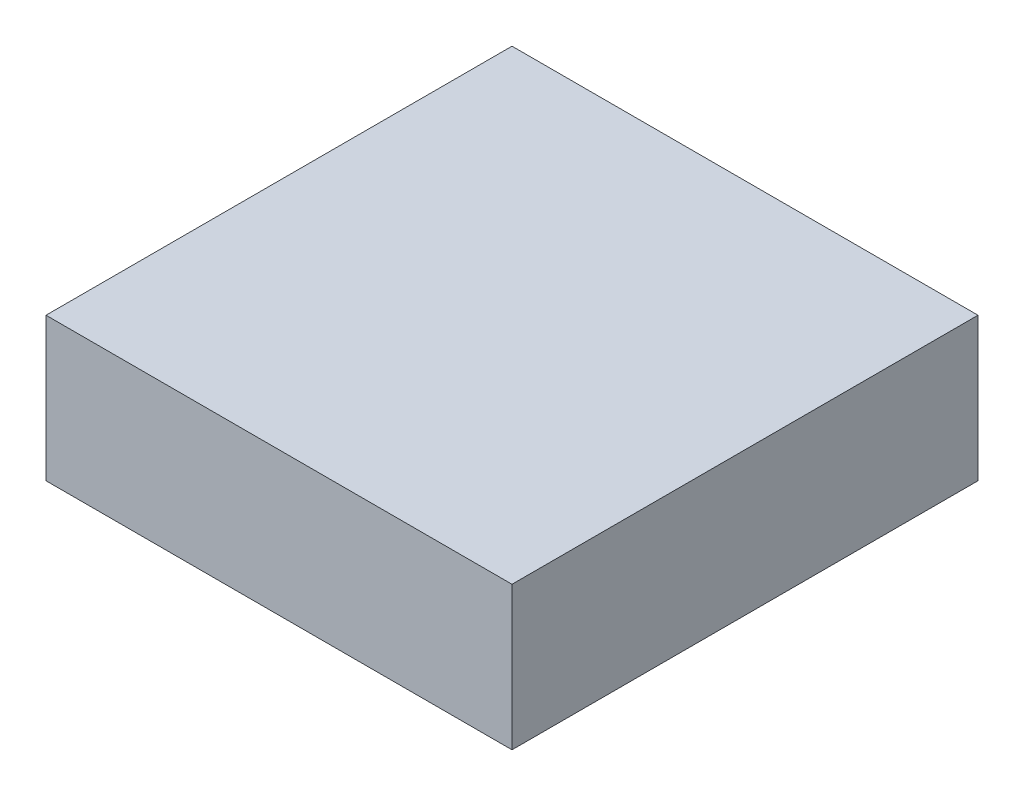
ISO-10303-21;
HEADER;
FILE_DESCRIPTION(('STEP AP214'),'2;1');
FILE_NAME('part.step','',(''),(''),'','','');
FILE_SCHEMA(('AUTOMOTIVE_DESIGN { 1 0 10303 214 1 1 1 1 }'));
ENDSEC;
DATA;
#1=APPLICATION_CONTEXT('core data for automotive mechanical design processes');
#2=APPLICATION_PROTOCOL_DEFINITION('international standard','automotive_design',2000,#1);
#3=PRODUCT_CONTEXT('',#1,'mechanical');
#4=PRODUCT('Part','Part','',(#3));
#5=PRODUCT_RELATED_PRODUCT_CATEGORY('part','',(#4));
#6=PRODUCT_DEFINITION_FORMATION('','',#4);
#7=PRODUCT_DEFINITION_CONTEXT('part definition',#1,'design');
#8=PRODUCT_DEFINITION('design','',#6,#7);
#9=PRODUCT_DEFINITION_SHAPE('','',#8);
#10=(LENGTH_UNIT() NAMED_UNIT(*) SI_UNIT(.MILLI.,.METRE.));
#11=(NAMED_UNIT(*) PLANE_ANGLE_UNIT() SI_UNIT($,.RADIAN.));
#12=(NAMED_UNIT(*) SI_UNIT($,.STERADIAN.) SOLID_ANGLE_UNIT());
#13=UNCERTAINTY_MEASURE_WITH_UNIT(LENGTH_MEASURE(1.E-05),#10,'distance_accuracy_value','');
#14=(GEOMETRIC_REPRESENTATION_CONTEXT(3) GLOBAL_UNCERTAINTY_ASSIGNED_CONTEXT((#13)) GLOBAL_UNIT_ASSIGNED_CONTEXT((#10,
#11,#12)) REPRESENTATION_CONTEXT('',''));
#15=CARTESIAN_POINT('',(0.,0.,0.));
#16=DIRECTION('',(0.,0.,1.));
#17=DIRECTION('',(1.,0.,0.));
#18=AXIS2_PLACEMENT_3D('',#15,#16,#17);
#19=CARTESIAN_POINT('',(65.,40.,65.));
#20=DIRECTION('',(-1.,0.,0.));
#21=DIRECTION('',(0.,0.,1.));
#22=AXIS2_PLACEMENT_3D('',#19,#20,#21);
#23=PLANE('',#22);
#24=DIRECTION('',(0.,0.,-1.));
#25=VECTOR('',#24,1.);
#26=CARTESIAN_POINT('',(65.,0.,65.));
#27=LINE('',#26,#25);
#28=CARTESIAN_POINT('',(65.,0.,65.));
#29=VERTEX_POINT('',#28);
#30=CARTESIAN_POINT('',(65.,0.,-65.));
#31=VERTEX_POINT('',#30);
#32=EDGE_CURVE('E104',#29,#31,#27,.T.);
#33=ORIENTED_EDGE('',*,*,#32,.T.);
#34=DIRECTION('',(0.,-1.,0.));
#35=VECTOR('',#34,1.);
#36=CARTESIAN_POINT('',(65.,40.,-65.));
#37=LINE('',#36,#35);
#38=CARTESIAN_POINT('',(65.,40.,-65.));
#39=VERTEX_POINT('',#38);
#40=EDGE_CURVE('E11',#39,#31,#37,.T.);
#41=ORIENTED_EDGE('',*,*,#40,.F.);
#42=DIRECTION('',(0.,0.,-1.));
#43=VECTOR('',#42,1.);
#44=CARTESIAN_POINT('',(65.,40.,65.));
#45=LINE('',#44,#43);
#46=CARTESIAN_POINT('',(65.,40.,65.));
#47=VERTEX_POINT('',#46);
#48=EDGE_CURVE('E92',#47,#39,#45,.T.);
#49=ORIENTED_EDGE('',*,*,#48,.F.);
#50=DIRECTION('',(0.,-1.,0.));
#51=VECTOR('',#50,1.);
#52=CARTESIAN_POINT('',(65.,40.,65.));
#53=LINE('',#52,#51);
#54=EDGE_CURVE('E100',#47,#29,#53,.T.);
#55=ORIENTED_EDGE('',*,*,#54,.T.);
#56=EDGE_LOOP('',(#33,#41,#49,#55));
#57=FACE_BOUND('',#56,.T.);
#58=ADVANCED_FACE('F41',(#57),#23,.F.);
#59=CARTESIAN_POINT('',(-65.,40.,-65.));
#60=DIRECTION('',(0.,0.,1.));
#61=DIRECTION('',(1.,0.,0.));
#62=AXIS2_PLACEMENT_3D('',#59,#60,#61);
#63=PLANE('',#62);
#64=DIRECTION('',(-1.,0.,0.));
#65=VECTOR('',#64,1.);
#66=CARTESIAN_POINT('',(-65.,0.,-65.));
#67=LINE('',#66,#65);
#68=CARTESIAN_POINT('',(-65.,0.,-65.));
#69=VERTEX_POINT('',#68);
#70=EDGE_CURVE('E96',#31,#69,#67,.T.);
#71=ORIENTED_EDGE('',*,*,#70,.T.);
#72=DIRECTION('',(0.,-1.,0.));
#73=VECTOR('',#72,1.);
#74=CARTESIAN_POINT('',(-65.,40.,-65.));
#75=LINE('',#74,#73);
#76=CARTESIAN_POINT('',(-65.,40.,-65.));
#77=VERTEX_POINT('',#76);
#78=EDGE_CURVE('E49',#77,#69,#75,.T.);
#79=ORIENTED_EDGE('',*,*,#78,.F.);
#80=DIRECTION('',(-1.,0.,0.));
#81=VECTOR('',#80,1.);
#82=CARTESIAN_POINT('',(-65.,40.,-65.));
#83=LINE('',#82,#81);
#84=EDGE_CURVE('E87',#39,#77,#83,.T.);
#85=ORIENTED_EDGE('',*,*,#84,.F.);
#86=ORIENTED_EDGE('',*,*,#40,.T.);
#87=EDGE_LOOP('',(#71,#79,#85,#86));
#88=FACE_BOUND('',#87,.T.);
#89=ADVANCED_FACE('F95',(#88),#63,.F.);
#90=CARTESIAN_POINT('',(-65.,40.,65.));
#91=DIRECTION('',(1.,0.,0.));
#92=DIRECTION('',(0.,0.,-1.));
#93=AXIS2_PLACEMENT_3D('',#90,#91,#92);
#94=PLANE('',#93);
#95=DIRECTION('',(0.,0.,1.));
#96=VECTOR('',#95,1.);
#97=CARTESIAN_POINT('',(-65.,0.,65.));
#98=LINE('',#97,#96);
#99=CARTESIAN_POINT('',(-65.,0.,65.));
#100=VERTEX_POINT('',#99);
#101=EDGE_CURVE('E74',#69,#100,#98,.T.);
#102=ORIENTED_EDGE('',*,*,#101,.T.);
#103=DIRECTION('',(0.,-1.,0.));
#104=VECTOR('',#103,1.);
#105=CARTESIAN_POINT('',(-65.,40.,65.));
#106=LINE('',#105,#104);
#107=CARTESIAN_POINT('',(-65.,40.,65.));
#108=VERTEX_POINT('',#107);
#109=EDGE_CURVE('E97',#108,#100,#106,.T.);
#110=ORIENTED_EDGE('',*,*,#109,.F.);
#111=DIRECTION('',(0.,0.,1.));
#112=VECTOR('',#111,1.);
#113=CARTESIAN_POINT('',(-65.,40.,65.));
#114=LINE('',#113,#112);
#115=EDGE_CURVE('E90',#77,#108,#114,.T.);
#116=ORIENTED_EDGE('',*,*,#115,.F.);
#117=ORIENTED_EDGE('',*,*,#78,.T.);
#118=EDGE_LOOP('',(#102,#110,#116,#117));
#119=FACE_BOUND('',#118,.T.);
#120=ADVANCED_FACE('F98',(#119),#94,.F.);
#121=CARTESIAN_POINT('',(-65.,40.,65.));
#122=DIRECTION('',(0.,0.,-1.));
#123=DIRECTION('',(-1.,0.,0.));
#124=AXIS2_PLACEMENT_3D('',#121,#122,#123);
#125=PLANE('',#124);
#126=DIRECTION('',(1.,0.,0.));
#127=VECTOR('',#126,1.);
#128=CARTESIAN_POINT('',(-65.,0.,65.));
#129=LINE('',#128,#127);
#130=EDGE_CURVE('E80',#100,#29,#129,.T.);
#131=ORIENTED_EDGE('',*,*,#130,.T.);
#132=ORIENTED_EDGE('',*,*,#54,.F.);
#133=DIRECTION('',(1.,0.,0.));
#134=VECTOR('',#133,1.);
#135=CARTESIAN_POINT('',(-65.,40.,65.));
#136=LINE('',#135,#134);
#137=EDGE_CURVE('E57',#108,#47,#136,.T.);
#138=ORIENTED_EDGE('',*,*,#137,.F.);
#139=ORIENTED_EDGE('',*,*,#109,.T.);
#140=EDGE_LOOP('',(#131,#132,#138,#139));
#141=FACE_BOUND('',#140,.T.);
#142=ADVANCED_FACE('F111',(#141),#125,.F.);
#143=CARTESIAN_POINT('',(0.,40.,0.));
#144=DIRECTION('',(0.,-1.,0.));
#145=DIRECTION('',(0.,0.,-1.));
#146=AXIS2_PLACEMENT_3D('',#143,#144,#145);
#147=PLANE('',#146);
#148=ORIENTED_EDGE('',*,*,#48,.T.);
#149=ORIENTED_EDGE('',*,*,#84,.T.);
#150=ORIENTED_EDGE('',*,*,#115,.T.);
#151=ORIENTED_EDGE('',*,*,#137,.T.);
#152=EDGE_LOOP('',(#148,#149,#150,#151));
#153=FACE_BOUND('',#152,.T.);
#154=ADVANCED_FACE('F88',(#153),#147,.F.);
#155=CARTESIAN_POINT('',(0.,0.,0.));
#156=DIRECTION('',(0.,-1.,0.));
#157=DIRECTION('',(0.,0.,-1.));
#158=AXIS2_PLACEMENT_3D('',#155,#156,#157);
#159=PLANE('',#158);
#160=ORIENTED_EDGE('',*,*,#32,.F.);
#161=ORIENTED_EDGE('',*,*,#130,.F.);
#162=ORIENTED_EDGE('',*,*,#101,.F.);
#163=ORIENTED_EDGE('',*,*,#70,.F.);
#164=EDGE_LOOP('',(#160,#161,#162,#163));
#165=FACE_BOUND('',#164,.T.);
#166=ADVANCED_FACE('F114',(#165),#159,.T.);
#167=CLOSED_SHELL('',(#58,#89,#120,#142,#154,#166));
#168=MANIFOLD_SOLID_BREP('B2',#167);
#169=ADVANCED_BREP_SHAPE_REPRESENTATION('',(#18,#168),#14);
#170=SHAPE_DEFINITION_REPRESENTATION(#9,#169);
ENDSEC;
END-ISO-10303-21;
